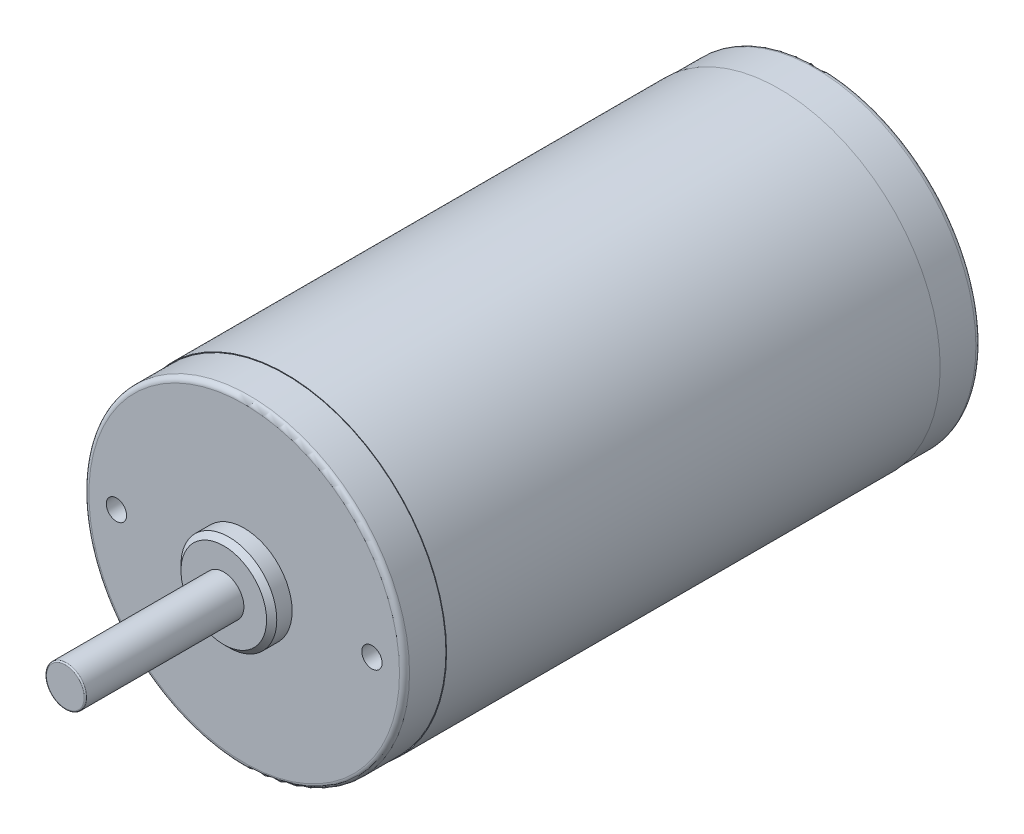
ISO-10303-21;
HEADER;
FILE_DESCRIPTION(('STEP AP214'),'2;1');
FILE_NAME('part.step','',(''),(''),'','','');
FILE_SCHEMA(('AUTOMOTIVE_DESIGN { 1 0 10303 214 1 1 1 1 }'));
ENDSEC;
DATA;
#1=APPLICATION_CONTEXT('core data for automotive mechanical design processes');
#2=APPLICATION_PROTOCOL_DEFINITION('international standard','automotive_design',2000,#1);
#3=PRODUCT_CONTEXT('',#1,'mechanical');
#4=PRODUCT('Part','Part','',(#3));
#5=PRODUCT_RELATED_PRODUCT_CATEGORY('part','',(#4));
#6=PRODUCT_DEFINITION_FORMATION('','',#4);
#7=PRODUCT_DEFINITION_CONTEXT('part definition',#1,'design');
#8=PRODUCT_DEFINITION('design','',#6,#7);
#9=PRODUCT_DEFINITION_SHAPE('','',#8);
#10=(LENGTH_UNIT() NAMED_UNIT(*) SI_UNIT(.MILLI.,.METRE.));
#11=(NAMED_UNIT(*) PLANE_ANGLE_UNIT() SI_UNIT($,.RADIAN.));
#12=(NAMED_UNIT(*) SI_UNIT($,.STERADIAN.) SOLID_ANGLE_UNIT());
#13=UNCERTAINTY_MEASURE_WITH_UNIT(LENGTH_MEASURE(1.E-05),#10,'distance_accuracy_value','');
#14=(GEOMETRIC_REPRESENTATION_CONTEXT(3) GLOBAL_UNCERTAINTY_ASSIGNED_CONTEXT((#13)) GLOBAL_UNIT_ASSIGNED_CONTEXT((#10,
#11,#12)) REPRESENTATION_CONTEXT('',''));
#15=CARTESIAN_POINT('',(0.,0.,0.));
#16=DIRECTION('',(0.,0.,1.));
#17=DIRECTION('',(1.,0.,0.));
#18=AXIS2_PLACEMENT_3D('',#15,#16,#17);
#19=CARTESIAN_POINT('',(35.56,109.2962,-95.554799999998));
#20=DIRECTION('',(0.,0.,-1.));
#21=DIRECTION('',(-1.,0.,0.));
#22=AXIS2_PLACEMENT_3D('',#19,#20,#21);
#23=PLANE('',#22);
#24=CARTESIAN_POINT('',(35.56,109.2962,-95.554799999998));
#25=DIRECTION('',(0.,0.,-1.));
#26=DIRECTION('',(-1.,0.,0.));
#27=AXIS2_PLACEMENT_3D('',#24,#25,#26);
#28=CIRCLE('',#27,30.8770000000005);
#29=CARTESIAN_POINT('',(4.6829999999995,109.2962,-95.554799999998));
#30=VERTEX_POINT('',#29);
#31=EDGE_CURVE('E107',#30,#30,#28,.T.);
#32=ORIENTED_EDGE('',*,*,#31,.T.);
#33=EDGE_LOOP('',(#32));
#34=FACE_BOUND('',#33,.T.);
#35=CARTESIAN_POINT('',(35.56,109.2962,-95.554799999998));
#36=DIRECTION('',(0.,0.,-1.));
#37=DIRECTION('',(-1.,0.,0.));
#38=AXIS2_PLACEMENT_3D('',#35,#36,#37);
#39=CIRCLE('',#38,15.0368000000003);
#40=CARTESIAN_POINT('',(20.5231999999997,109.2962,-95.554799999998));
#41=VERTEX_POINT('',#40);
#42=EDGE_CURVE('E74',#41,#41,#39,.T.);
#43=ORIENTED_EDGE('',*,*,#42,.F.);
#44=EDGE_LOOP('',(#43));
#45=FACE_BOUND('',#44,.T.);
#46=ADVANCED_FACE('F39',(#34,#45),#23,.T.);
#47=CARTESIAN_POINT('',(35.56,109.2962,-87.325199999998));
#48=DIRECTION('',(0.,0.,-1.));
#49=DIRECTION('',(-1.,0.,0.));
#50=AXIS2_PLACEMENT_3D('',#47,#48,#49);
#51=PLANE('',#50);
#52=CARTESIAN_POINT('',(35.56,109.2962,-87.325199999998));
#53=DIRECTION('',(0.,0.,-1.));
#54=DIRECTION('',(-1.,0.,0.));
#55=AXIS2_PLACEMENT_3D('',#52,#53,#54);
#56=CIRCLE('',#55,32.0040000000005);
#57=CARTESIAN_POINT('',(3.5559999999995,109.2962,-87.325199999998));
#58=VERTEX_POINT('',#57);
#59=EDGE_CURVE('E86',#58,#58,#56,.T.);
#60=ORIENTED_EDGE('',*,*,#59,.T.);
#61=EDGE_LOOP('',(#60));
#62=FACE_BOUND('',#61,.T.);
#63=CARTESIAN_POINT('',(35.56,109.2962,-87.325199999998));
#64=DIRECTION('',(0.,0.,-1.));
#65=DIRECTION('',(-1.,0.,0.));
#66=AXIS2_PLACEMENT_3D('',#63,#64,#65);
#67=CIRCLE('',#66,31.8770000000005);
#68=CARTESIAN_POINT('',(3.6829999999995,109.2962,-87.325199999998));
#69=VERTEX_POINT('',#68);
#70=EDGE_CURVE('E77',#69,#69,#67,.T.);
#71=ORIENTED_EDGE('',*,*,#70,.F.);
#72=EDGE_LOOP('',(#71));
#73=FACE_BOUND('',#72,.T.);
#74=ADVANCED_FACE('F133',(#62,#73),#51,.T.);
#75=CARTESIAN_POINT('',(35.56,109.2962,23.114));
#76=DIRECTION('',(0.,0.,1.));
#77=DIRECTION('',(1.,0.,0.));
#78=AXIS2_PLACEMENT_3D('',#75,#76,#77);
#79=PLANE('',#78);
#80=CARTESIAN_POINT('',(35.56,109.2962,23.114));
#81=DIRECTION('',(0.,0.,1.));
#82=DIRECTION('',(1.,0.,0.));
#83=AXIS2_PLACEMENT_3D('',#80,#81,#82);
#84=CIRCLE('',#83,8.50900000182338);
#85=CARTESIAN_POINT('',(44.0690000018234,109.2962,23.114));
#86=VERTEX_POINT('',#85);
#87=EDGE_CURVE('E98',#86,#86,#84,.T.);
#88=ORIENTED_EDGE('',*,*,#87,.T.);
#89=EDGE_LOOP('',(#88));
#90=FACE_BOUND('',#89,.T.);
#91=CARTESIAN_POINT('',(35.56,109.2962,23.114));
#92=DIRECTION('',(0.,0.,1.));
#93=DIRECTION('',(1.,0.,0.));
#94=AXIS2_PLACEMENT_3D('',#91,#92,#93);
#95=CIRCLE('',#94,4.00000000000007);
#96=CARTESIAN_POINT('',(39.5600000000001,109.2962,23.114));
#97=VERTEX_POINT('',#96);
#98=EDGE_CURVE('E80',#97,#97,#95,.T.);
#99=ORIENTED_EDGE('',*,*,#98,.F.);
#100=EDGE_LOOP('',(#99));
#101=FACE_BOUND('',#100,.T.);
#102=ADVANCED_FACE('F139',(#90,#101),#79,.T.);
#103=CARTESIAN_POINT('',(67.5640000000005,109.2962,10.8204000000007));
#104=DIRECTION('',(0.,0.,1.));
#105=DIRECTION('',(1.,0.,0.));
#106=AXIS2_PLACEMENT_3D('',#103,#104,#105);
#107=PLANE('',#106);
#108=CARTESIAN_POINT('',(35.56,109.2962,10.8204000000007));
#109=DIRECTION('',(0.,0.,-1.));
#110=DIRECTION('',(-1.,0.,0.));
#111=AXIS2_PLACEMENT_3D('',#108,#109,#110);
#112=CIRCLE('',#111,32.0040000000005);
#113=CARTESIAN_POINT('',(3.5559999999995,109.2962,10.8204000000007));
#114=VERTEX_POINT('',#113);
#115=EDGE_CURVE('E89',#114,#114,#112,.T.);
#116=ORIENTED_EDGE('',*,*,#115,.F.);
#117=EDGE_LOOP('',(#116));
#118=FACE_BOUND('',#117,.T.);
#119=CARTESIAN_POINT('',(35.56,109.2962,10.8204000000007));
#120=DIRECTION('',(0.,0.,1.));
#121=DIRECTION('',(1.,0.,0.));
#122=AXIS2_PLACEMENT_3D('',#119,#120,#121);
#123=CIRCLE('',#122,31.8770000000005);
#124=CARTESIAN_POINT('',(67.4370000000005,109.2962,10.8204000000007));
#125=VERTEX_POINT('',#124);
#126=EDGE_CURVE('E83',#125,#125,#123,.T.);
#127=ORIENTED_EDGE('',*,*,#126,.F.);
#128=EDGE_LOOP('',(#127));
#129=FACE_BOUND('',#128,.T.);
#130=ADVANCED_FACE('F162',(#118,#129),#107,.T.);
#131=CARTESIAN_POINT('',(35.56,109.2962,10.8204000000007));
#132=DIRECTION('',(0.,0.,-1.));
#133=DIRECTION('',(-1.,0.,0.));
#134=AXIS2_PLACEMENT_3D('',#131,#132,#133);
#135=CYLINDRICAL_SURFACE('',#134,32.0040000000005);
#136=ORIENTED_EDGE('',*,*,#115,.T.);
#137=EDGE_LOOP('',(#136));
#138=FACE_BOUND('',#137,.T.);
#139=ORIENTED_EDGE('',*,*,#59,.F.);
#140=EDGE_LOOP('',(#139));
#141=FACE_BOUND('',#140,.T.);
#142=ADVANCED_FACE('F173',(#138,#141),#135,.T.);
#143=CARTESIAN_POINT('',(35.56,109.2962,19.05));
#144=DIRECTION('',(0.,0.,-1.));
#145=DIRECTION('',(-1.,0.,0.));
#146=AXIS2_PLACEMENT_3D('',#143,#144,#145);
#147=CYLINDRICAL_SURFACE('',#146,31.8770000000005);
#148=CARTESIAN_POINT('',(35.56,109.2962,18.05));
#149=DIRECTION('',(0.,0.,1.));
#150=DIRECTION('',(1.,0.,0.));
#151=AXIS2_PLACEMENT_3D('',#148,#149,#150);
#152=CIRCLE('',#151,31.8770000000005);
#153=CARTESIAN_POINT('',(67.4370000000005,109.2962,18.05));
#154=VERTEX_POINT('',#153);
#155=EDGE_CURVE('E116',#154,#154,#152,.F.);
#156=ORIENTED_EDGE('',*,*,#155,.T.);
#157=EDGE_LOOP('',(#156));
#158=FACE_BOUND('',#157,.T.);
#159=ORIENTED_EDGE('',*,*,#126,.T.);
#160=EDGE_LOOP('',(#159));
#161=FACE_BOUND('',#160,.T.);
#162=ADVANCED_FACE('F170',(#158,#161),#147,.T.);
#163=CARTESIAN_POINT('',(35.56,109.2962,19.05));
#164=DIRECTION('',(0.,0.,1.));
#165=DIRECTION('',(1.,0.,0.));
#166=AXIS2_PLACEMENT_3D('',#163,#164,#165);
#167=PLANE('',#166);
#168=CARTESIAN_POINT('',(35.56,109.2962,19.05));
#169=DIRECTION('',(0.,0.,1.));
#170=DIRECTION('',(1.,0.,0.));
#171=AXIS2_PLACEMENT_3D('',#168,#169,#170);
#172=CIRCLE('',#171,30.8770000000005);
#173=CARTESIAN_POINT('',(66.4370000000005,109.2962,19.05));
#174=VERTEX_POINT('',#173);
#175=EDGE_CURVE('E113',#174,#174,#172,.T.);
#176=ORIENTED_EDGE('',*,*,#175,.T.);
#177=EDGE_LOOP('',(#176));
#178=FACE_BOUND('',#177,.T.);
#179=CARTESIAN_POINT('',(10.1599999999994,109.2962,19.05));
#180=DIRECTION('',(0.,0.,1.));
#181=DIRECTION('',(1.,0.,0.));
#182=AXIS2_PLACEMENT_3D('',#179,#180,#181);
#183=CIRCLE('',#182,2.01930000000003);
#184=CARTESIAN_POINT('',(12.1792999999994,109.2962,19.05));
#185=VERTEX_POINT('',#184);
#186=EDGE_CURVE('E64',#185,#185,#183,.T.);
#187=ORIENTED_EDGE('',*,*,#186,.F.);
#188=EDGE_LOOP('',(#187));
#189=FACE_BOUND('',#188,.T.);
#190=CARTESIAN_POINT('',(60.96,109.2962,19.05));
#191=DIRECTION('',(0.,0.,1.));
#192=DIRECTION('',(1.,0.,0.));
#193=AXIS2_PLACEMENT_3D('',#190,#191,#192);
#194=CIRCLE('',#193,2.01930000000003);
#195=CARTESIAN_POINT('',(62.9793,109.2962,19.05));
#196=VERTEX_POINT('',#195);
#197=EDGE_CURVE('E63',#196,#196,#194,.T.);
#198=ORIENTED_EDGE('',*,*,#197,.F.);
#199=EDGE_LOOP('',(#198));
#200=FACE_BOUND('',#199,.T.);
#201=CARTESIAN_POINT('',(35.56,109.2962,19.05));
#202=DIRECTION('',(0.,0.,1.));
#203=DIRECTION('',(1.,0.,0.));
#204=AXIS2_PLACEMENT_3D('',#201,#202,#203);
#205=CIRCLE('',#204,9.52500000000019);
#206=CARTESIAN_POINT('',(45.0850000000002,109.2962,19.05));
#207=VERTEX_POINT('',#206);
#208=EDGE_CURVE('E92',#207,#207,#205,.T.);
#209=ORIENTED_EDGE('',*,*,#208,.F.);
#210=EDGE_LOOP('',(#209));
#211=FACE_BOUND('',#210,.T.);
#212=ADVANCED_FACE('F166',(#178,#189,#200,#211),#167,.T.);
#213=CARTESIAN_POINT('',(35.56,109.2962,23.114));
#214=DIRECTION('',(0.,0.,-1.));
#215=DIRECTION('',(-1.,0.,0.));
#216=AXIS2_PLACEMENT_3D('',#213,#214,#215);
#217=CYLINDRICAL_SURFACE('',#216,9.52500000000019);
#218=CARTESIAN_POINT('',(35.56,109.2962,22.0979999999996));
#219=DIRECTION('',(0.,0.,1.));
#220=DIRECTION('',(1.,0.,0.));
#221=AXIS2_PLACEMENT_3D('',#218,#219,#220);
#222=CIRCLE('',#221,9.52500000000019);
#223=CARTESIAN_POINT('',(45.0850000000002,109.2962,22.0979999999996));
#224=VERTEX_POINT('',#223);
#225=EDGE_CURVE('E95',#224,#224,#222,.F.);
#226=ORIENTED_EDGE('',*,*,#225,.T.);
#227=EDGE_LOOP('',(#226));
#228=FACE_BOUND('',#227,.T.);
#229=ORIENTED_EDGE('',*,*,#208,.T.);
#230=EDGE_LOOP('',(#229));
#231=FACE_BOUND('',#230,.T.);
#232=ADVANCED_FACE('F158',(#228,#231),#217,.T.);
#233=CARTESIAN_POINT('',(35.56,109.2962,54.614));
#234=DIRECTION('',(0.,0.,-1.));
#235=DIRECTION('',(-1.,0.,0.));
#236=AXIS2_PLACEMENT_3D('',#233,#234,#235);
#237=CYLINDRICAL_SURFACE('',#236,4.00000000000007);
#238=CARTESIAN_POINT('',(35.56,109.2962,54.36));
#239=DIRECTION('',(0.,0.,1.));
#240=DIRECTION('',(1.,0.,0.));
#241=AXIS2_PLACEMENT_3D('',#238,#239,#240);
#242=CIRCLE('',#241,4.00000000000007);
#243=CARTESIAN_POINT('',(39.5600000000001,109.2962,54.36));
#244=VERTEX_POINT('',#243);
#245=EDGE_CURVE('E104',#244,#244,#242,.F.);
#246=ORIENTED_EDGE('',*,*,#245,.T.);
#247=EDGE_LOOP('',(#246));
#248=FACE_BOUND('',#247,.T.);
#249=ORIENTED_EDGE('',*,*,#98,.T.);
#250=EDGE_LOOP('',(#249));
#251=FACE_BOUND('',#250,.T.);
#252=ADVANCED_FACE('F154',(#248,#251),#237,.T.);
#253=CARTESIAN_POINT('',(35.56,109.2962,54.614));
#254=DIRECTION('',(0.,0.,1.));
#255=DIRECTION('',(1.,0.,0.));
#256=AXIS2_PLACEMENT_3D('',#253,#254,#255);
#257=PLANE('',#256);
#258=CARTESIAN_POINT('',(35.56,109.2962,54.614));
#259=DIRECTION('',(0.,0.,1.));
#260=DIRECTION('',(1.,0.,0.));
#261=AXIS2_PLACEMENT_3D('',#258,#259,#260);
#262=CIRCLE('',#261,3.74600000000007);
#263=CARTESIAN_POINT('',(39.3060000000001,109.2962,54.614));
#264=VERTEX_POINT('',#263);
#265=EDGE_CURVE('E101',#264,#264,#262,.T.);
#266=ORIENTED_EDGE('',*,*,#265,.T.);
#267=EDGE_LOOP('',(#266));
#268=FACE_BOUND('',#267,.T.);
#269=ADVANCED_FACE('F150',(#268),#257,.T.);
#270=CARTESIAN_POINT('',(35.56,109.2962,-95.554799999998));
#271=DIRECTION('',(0.,0.,1.));
#272=DIRECTION('',(1.,0.,0.));
#273=AXIS2_PLACEMENT_3D('',#270,#271,#272);
#274=CYLINDRICAL_SURFACE('',#273,31.8770000000005);
#275=CARTESIAN_POINT('',(35.56,109.2962,-94.554799999998));
#276=DIRECTION('',(0.,0.,-1.));
#277=DIRECTION('',(-1.,0.,0.));
#278=AXIS2_PLACEMENT_3D('',#275,#276,#277);
#279=CIRCLE('',#278,31.8770000000005);
#280=CARTESIAN_POINT('',(3.6829999999995,109.2962,-94.554799999998));
#281=VERTEX_POINT('',#280);
#282=EDGE_CURVE('E110',#281,#281,#279,.F.);
#283=ORIENTED_EDGE('',*,*,#282,.T.);
#284=EDGE_LOOP('',(#283));
#285=FACE_BOUND('',#284,.T.);
#286=ORIENTED_EDGE('',*,*,#70,.T.);
#287=EDGE_LOOP('',(#286));
#288=FACE_BOUND('',#287,.T.);
#289=ADVANCED_FACE('F147',(#285,#288),#274,.T.);
#290=CARTESIAN_POINT('',(35.56,109.2962,-100.317299999998));
#291=DIRECTION('',(0.,0.,1.));
#292=DIRECTION('',(1.,0.,0.));
#293=AXIS2_PLACEMENT_3D('',#290,#291,#292);
#294=CYLINDRICAL_SURFACE('',#293,15.0368000000003);
#295=CARTESIAN_POINT('',(35.56,109.2962,-99.317299999998));
#296=DIRECTION('',(0.,0.,-1.));
#297=DIRECTION('',(-1.,0.,0.));
#298=AXIS2_PLACEMENT_3D('',#295,#296,#297);
#299=CIRCLE('',#298,15.0368000000003);
#300=CARTESIAN_POINT('',(20.5231999999997,109.2962,-99.317299999998));
#301=VERTEX_POINT('',#300);
#302=EDGE_CURVE('E11',#301,#301,#299,.F.);
#303=ORIENTED_EDGE('',*,*,#302,.T.);
#304=EDGE_LOOP('',(#303));
#305=FACE_BOUND('',#304,.T.);
#306=ORIENTED_EDGE('',*,*,#42,.T.);
#307=EDGE_LOOP('',(#306));
#308=FACE_BOUND('',#307,.T.);
#309=ADVANCED_FACE('F145',(#305,#308),#294,.T.);
#310=CARTESIAN_POINT('',(35.56,109.2962,-100.317299999998));
#311=DIRECTION('',(0.,0.,-1.));
#312=DIRECTION('',(-1.,0.,0.));
#313=AXIS2_PLACEMENT_3D('',#310,#311,#312);
#314=PLANE('',#313);
#315=CARTESIAN_POINT('',(35.56,109.2962,-100.317299999998));
#316=DIRECTION('',(0.,0.,-1.));
#317=DIRECTION('',(-1.,0.,0.));
#318=AXIS2_PLACEMENT_3D('',#315,#316,#317);
#319=CIRCLE('',#318,14.0368000000003);
#320=CARTESIAN_POINT('',(21.5231999999997,109.2962,-100.317299999998));
#321=VERTEX_POINT('',#320);
#322=EDGE_CURVE('E47',#321,#321,#319,.T.);
#323=ORIENTED_EDGE('',*,*,#322,.T.);
#324=EDGE_LOOP('',(#323));
#325=FACE_BOUND('',#324,.T.);
#326=ADVANCED_FACE('F121',(#325),#314,.T.);
#327=CARTESIAN_POINT('',(60.96,109.2962,5.43560000000074));
#328=DIRECTION('',(0.,0.,1.));
#329=DIRECTION('',(1.,0.,0.));
#330=AXIS2_PLACEMENT_3D('',#327,#328,#329);
#331=CONICAL_SURFACE('',#330,2.01930000000003,1.0297442575);
#332=CARTESIAN_POINT('',(60.96,109.2962,4.22228214876452));
#333=VERTEX_POINT('',#332);
#334=VERTEX_LOOP('',#333);
#335=FACE_BOUND('',#334,.T.);
#336=CARTESIAN_POINT('',(60.96,109.2962,5.43560000000074));
#337=DIRECTION('',(0.,0.,1.));
#338=DIRECTION('',(1.,0.,0.));
#339=AXIS2_PLACEMENT_3D('',#336,#337,#338);
#340=CIRCLE('',#339,2.01930000000003);
#341=CARTESIAN_POINT('',(62.9793,109.2962,5.43560000000074));
#342=VERTEX_POINT('',#341);
#343=EDGE_CURVE('E67',#342,#342,#340,.T.);
#344=ORIENTED_EDGE('',*,*,#343,.T.);
#345=EDGE_LOOP('',(#344));
#346=FACE_BOUND('',#345,.T.);
#347=ADVANCED_FACE('F237',(#335,#346),#331,.F.);
#348=CARTESIAN_POINT('',(60.96,109.2962,19.05));
#349=DIRECTION('',(0.,0.,1.));
#350=DIRECTION('',(1.,0.,0.));
#351=AXIS2_PLACEMENT_3D('',#348,#349,#350);
#352=CYLINDRICAL_SURFACE('',#351,2.01930000000003);
#353=ORIENTED_EDGE('',*,*,#343,.F.);
#354=EDGE_LOOP('',(#353));
#355=FACE_BOUND('',#354,.T.);
#356=ORIENTED_EDGE('',*,*,#197,.T.);
#357=EDGE_LOOP('',(#356));
#358=FACE_BOUND('',#357,.T.);
#359=ADVANCED_FACE('F57',(#355,#358),#352,.F.);
#360=CARTESIAN_POINT('',(10.1599999999994,109.2962,5.4356000000007));
#361=DIRECTION('',(0.,0.,1.));
#362=DIRECTION('',(1.,0.,0.));
#363=AXIS2_PLACEMENT_3D('',#360,#361,#362);
#364=CONICAL_SURFACE('',#363,2.01930000000003,1.0297442575);
#365=CARTESIAN_POINT('',(10.1599999999994,109.2962,4.22228214876447));
#366=VERTEX_POINT('',#365);
#367=VERTEX_LOOP('',#366);
#368=FACE_BOUND('',#367,.T.);
#369=CARTESIAN_POINT('',(10.1599999999994,109.2962,5.4356000000007));
#370=DIRECTION('',(0.,0.,1.));
#371=DIRECTION('',(1.,0.,0.));
#372=AXIS2_PLACEMENT_3D('',#369,#370,#371);
#373=CIRCLE('',#372,2.01930000000003);
#374=CARTESIAN_POINT('',(12.1792999999994,109.2962,5.4356000000007));
#375=VERTEX_POINT('',#374);
#376=EDGE_CURVE('E61',#375,#375,#373,.T.);
#377=ORIENTED_EDGE('',*,*,#376,.T.);
#378=EDGE_LOOP('',(#377));
#379=FACE_BOUND('',#378,.T.);
#380=ADVANCED_FACE('F53',(#368,#379),#364,.F.);
#381=CARTESIAN_POINT('',(10.1599999999994,109.2962,19.05));
#382=DIRECTION('',(0.,0.,1.));
#383=DIRECTION('',(1.,0.,0.));
#384=AXIS2_PLACEMENT_3D('',#381,#382,#383);
#385=CYLINDRICAL_SURFACE('',#384,2.01930000000003);
#386=ORIENTED_EDGE('',*,*,#376,.F.);
#387=EDGE_LOOP('',(#386));
#388=FACE_BOUND('',#387,.T.);
#389=ORIENTED_EDGE('',*,*,#186,.T.);
#390=EDGE_LOOP('',(#389));
#391=FACE_BOUND('',#390,.T.);
#392=ADVANCED_FACE('F56',(#388,#391),#385,.F.);
#393=CARTESIAN_POINT('',(35.56,109.2962,22.0979999999996));
#394=DIRECTION('',(0.,0.,-1.));
#395=DIRECTION('',(-1.,0.,0.));
#396=AXIS2_PLACEMENT_3D('',#393,#394,#395);
#397=CONICAL_SURFACE('',#396,9.52500000000019,0.785398162500005);
#398=ORIENTED_EDGE('',*,*,#87,.F.);
#399=EDGE_LOOP('',(#398));
#400=FACE_BOUND('',#399,.T.);
#401=ORIENTED_EDGE('',*,*,#225,.F.);
#402=EDGE_LOOP('',(#401));
#403=FACE_BOUND('',#402,.T.);
#404=ADVANCED_FACE('F182',(#400,#403),#397,.T.);
#405=CARTESIAN_POINT('',(35.56,109.2962,54.36));
#406=DIRECTION('',(0.,0.,1.));
#407=DIRECTION('',(1.,0.,0.));
#408=AXIS2_PLACEMENT_3D('',#405,#406,#407);
#409=TOROIDAL_SURFACE('',#408,3.74600000000007,0.254);
#410=ORIENTED_EDGE('',*,*,#245,.F.);
#411=EDGE_LOOP('',(#410));
#412=FACE_BOUND('',#411,.T.);
#413=ORIENTED_EDGE('',*,*,#265,.F.);
#414=EDGE_LOOP('',(#413));
#415=FACE_BOUND('',#414,.T.);
#416=ADVANCED_FACE('F185',(#412,#415),#409,.T.);
#417=CARTESIAN_POINT('',(35.56,109.2962,-94.554799999998));
#418=DIRECTION('',(0.,0.,-1.));
#419=DIRECTION('',(-1.,0.,0.));
#420=AXIS2_PLACEMENT_3D('',#417,#418,#419);
#421=TOROIDAL_SURFACE('',#420,30.8770000000005,1.);
#422=ORIENTED_EDGE('',*,*,#282,.F.);
#423=EDGE_LOOP('',(#422));
#424=FACE_BOUND('',#423,.T.);
#425=ORIENTED_EDGE('',*,*,#31,.F.);
#426=EDGE_LOOP('',(#425));
#427=FACE_BOUND('',#426,.T.);
#428=ADVANCED_FACE('F129',(#424,#427),#421,.T.);
#429=CARTESIAN_POINT('',(35.56,109.2962,18.05));
#430=DIRECTION('',(0.,0.,1.));
#431=DIRECTION('',(1.,0.,0.));
#432=AXIS2_PLACEMENT_3D('',#429,#430,#431);
#433=TOROIDAL_SURFACE('',#432,30.8770000000005,1.);
#434=ORIENTED_EDGE('',*,*,#155,.F.);
#435=EDGE_LOOP('',(#434));
#436=FACE_BOUND('',#435,.T.);
#437=ORIENTED_EDGE('',*,*,#175,.F.);
#438=EDGE_LOOP('',(#437));
#439=FACE_BOUND('',#438,.T.);
#440=ADVANCED_FACE('F124',(#436,#439),#433,.T.);
#441=CARTESIAN_POINT('',(35.56,109.2962,-99.317299999998));
#442=DIRECTION('',(0.,0.,-1.));
#443=DIRECTION('',(-1.,0.,0.));
#444=AXIS2_PLACEMENT_3D('',#441,#442,#443);
#445=TOROIDAL_SURFACE('',#444,14.0368000000003,1.);
#446=ORIENTED_EDGE('',*,*,#302,.F.);
#447=EDGE_LOOP('',(#446));
#448=FACE_BOUND('',#447,.T.);
#449=ORIENTED_EDGE('',*,*,#322,.F.);
#450=EDGE_LOOP('',(#449));
#451=FACE_BOUND('',#450,.T.);
#452=ADVANCED_FACE('F41',(#448,#451),#445,.T.);
#453=CLOSED_SHELL('',(#46,#74,#102,#130,#142,#162,#212,#232,#252,#269,#289,#309,#326,#347,#359,
#380,#392,#404,#416,#428,#440,#452));
#454=MANIFOLD_SOLID_BREP('B2',#453);
#455=ADVANCED_BREP_SHAPE_REPRESENTATION('',(#18,#454),#14);
#456=SHAPE_DEFINITION_REPRESENTATION(#9,#455);
ENDSEC;
END-ISO-10303-21;
